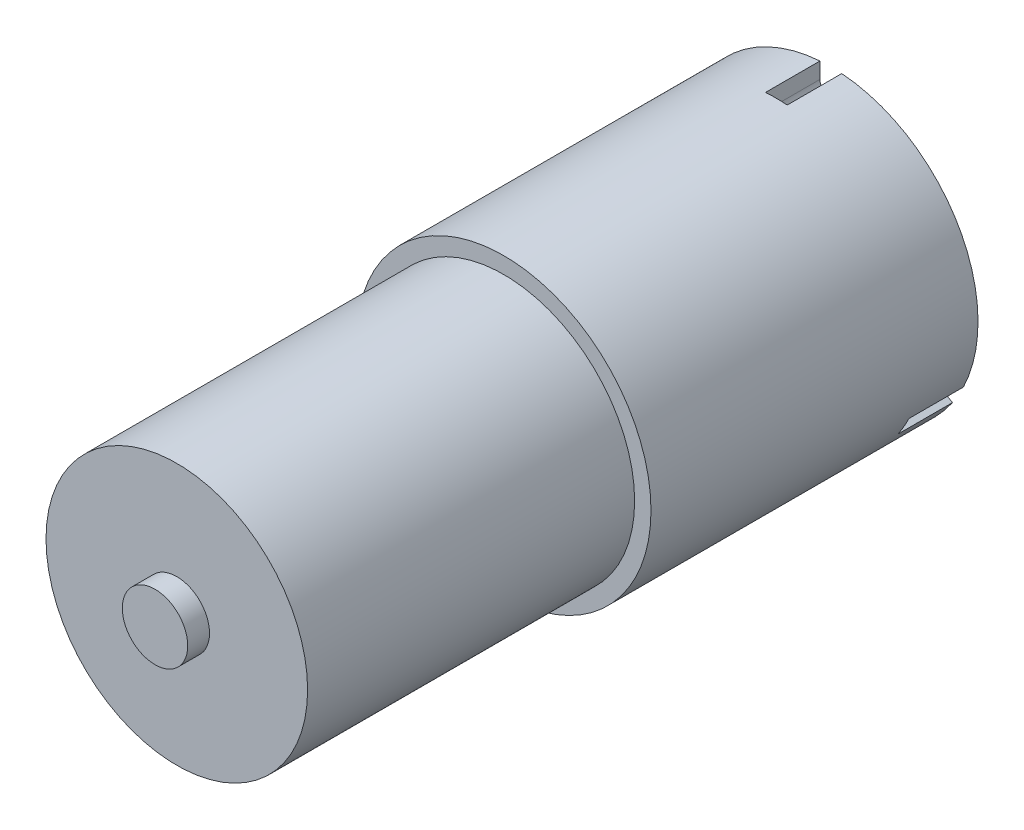
ISO-10303-21;
HEADER;
FILE_DESCRIPTION(('STEP AP214'),'2;1');
FILE_NAME('part.step','',(''),(''),'','','');
FILE_SCHEMA(('AUTOMOTIVE_DESIGN { 1 0 10303 214 1 1 1 1 }'));
ENDSEC;
DATA;
#1=APPLICATION_CONTEXT('core data for automotive mechanical design processes');
#2=APPLICATION_PROTOCOL_DEFINITION('international standard','automotive_design',2000,#1);
#3=PRODUCT_CONTEXT('',#1,'mechanical');
#4=PRODUCT('Part','Part','',(#3));
#5=PRODUCT_RELATED_PRODUCT_CATEGORY('part','',(#4));
#6=PRODUCT_DEFINITION_FORMATION('','',#4);
#7=PRODUCT_DEFINITION_CONTEXT('part definition',#1,'design');
#8=PRODUCT_DEFINITION('design','',#6,#7);
#9=PRODUCT_DEFINITION_SHAPE('','',#8);
#10=(LENGTH_UNIT() NAMED_UNIT(*) SI_UNIT(.MILLI.,.METRE.));
#11=(NAMED_UNIT(*) PLANE_ANGLE_UNIT() SI_UNIT($,.RADIAN.));
#12=(NAMED_UNIT(*) SI_UNIT($,.STERADIAN.) SOLID_ANGLE_UNIT());
#13=UNCERTAINTY_MEASURE_WITH_UNIT(LENGTH_MEASURE(1.E-05),#10,'distance_accuracy_value','');
#14=(GEOMETRIC_REPRESENTATION_CONTEXT(3) GLOBAL_UNCERTAINTY_ASSIGNED_CONTEXT((#13)) GLOBAL_UNIT_ASSIGNED_CONTEXT((#10,
#11,#12)) REPRESENTATION_CONTEXT('',''));
#15=CARTESIAN_POINT('',(0.,0.,0.));
#16=DIRECTION('',(0.,0.,1.));
#17=DIRECTION('',(1.,0.,0.));
#18=AXIS2_PLACEMENT_3D('',#15,#16,#17);
#19=CARTESIAN_POINT('',(0.,0.,30.));
#20=DIRECTION('',(0.,0.,-1.));
#21=DIRECTION('',(-1.,0.,0.));
#22=AXIS2_PLACEMENT_3D('',#19,#20,#21);
#23=CYLINDRICAL_SURFACE('',#22,13.5);
#24=CARTESIAN_POINT('',(0.,0.,0.));
#25=DIRECTION('',(0.,0.,1.));
#26=DIRECTION('',(1.,0.,0.));
#27=AXIS2_PLACEMENT_3D('',#24,#25,#26);
#28=CIRCLE('',#27,13.5);
#29=CARTESIAN_POINT('',(12.1592238163608,-5.86543060513416,0.));
#30=VERTEX_POINT('',#29);
#31=CARTESIAN_POINT('',(1.,13.4629120178363,0.));
#32=VERTEX_POINT('',#31);
#33=EDGE_CURVE('E210',#30,#32,#28,.T.);
#34=ORIENTED_EDGE('',*,*,#33,.T.);
#35=DIRECTION('',(0.,0.,-1.));
#36=VECTOR('',#35,1.);
#37=CARTESIAN_POINT('',(1.,13.4629120178363,30.));
#38=LINE('',#37,#36);
#39=CARTESIAN_POINT('',(1.,13.4629120178363,5.));
#40=VERTEX_POINT('',#39);
#41=EDGE_CURVE('E196',#32,#40,#38,.F.);
#42=ORIENTED_EDGE('',*,*,#41,.T.);
#43=CARTESIAN_POINT('',(0.,0.,5.));
#44=DIRECTION('',(0.,0.,-1.));
#45=DIRECTION('',(-1.,0.,0.));
#46=AXIS2_PLACEMENT_3D('',#43,#44,#45);
#47=CIRCLE('',#46,13.5);
#48=CARTESIAN_POINT('',(-1.,13.4629120178363,5.));
#49=VERTEX_POINT('',#48);
#50=EDGE_CURVE('E232',#49,#40,#47,.T.);
#51=ORIENTED_EDGE('',*,*,#50,.F.);
#52=DIRECTION('',(0.,0.,-1.));
#53=VECTOR('',#52,1.);
#54=CARTESIAN_POINT('',(-1.,13.4629120178363,30.));
#55=LINE('',#54,#53);
#56=CARTESIAN_POINT('',(-1.,13.4629120178363,0.));
#57=VERTEX_POINT('',#56);
#58=EDGE_CURVE('E136',#49,#57,#55,.T.);
#59=ORIENTED_EDGE('',*,*,#58,.T.);
#60=CARTESIAN_POINT('',(-12.1592238163612,-5.86543060513323,0.));
#61=VERTEX_POINT('',#60);
#62=EDGE_CURVE('E216',#57,#61,#28,.T.);
#63=ORIENTED_EDGE('',*,*,#62,.T.);
#64=DIRECTION('',(0.,0.,-1.));
#65=VECTOR('',#64,1.);
#66=CARTESIAN_POINT('',(-12.1592238163612,-5.86543060513323,30.));
#67=LINE('',#66,#65);
#68=CARTESIAN_POINT('',(-12.1592238163612,-5.86543060513323,5.));
#69=VERTEX_POINT('',#68);
#70=EDGE_CURVE('E192',#61,#69,#67,.F.);
#71=ORIENTED_EDGE('',*,*,#70,.T.);
#72=CARTESIAN_POINT('',(0.,0.,5.));
#73=DIRECTION('',(0.,0.,-1.));
#74=DIRECTION('',(-1.,0.,0.));
#75=AXIS2_PLACEMENT_3D('',#72,#73,#74);
#76=CIRCLE('',#75,13.5);
#77=CARTESIAN_POINT('',(-11.1592238163613,-7.59748141270214,5.));
#78=VERTEX_POINT('',#77);
#79=EDGE_CURVE('E230',#78,#69,#76,.T.);
#80=ORIENTED_EDGE('',*,*,#79,.F.);
#81=DIRECTION('',(0.,0.,-1.));
#82=VECTOR('',#81,1.);
#83=CARTESIAN_POINT('',(-11.1592238163613,-7.59748141270214,30.));
#84=LINE('',#83,#82);
#85=CARTESIAN_POINT('',(-11.1592238163613,-7.59748141270214,0.));
#86=VERTEX_POINT('',#85);
#87=EDGE_CURVE('E189',#78,#86,#84,.T.);
#88=ORIENTED_EDGE('',*,*,#87,.T.);
#89=CARTESIAN_POINT('',(11.1592238163607,-7.597481412703,0.));
#90=VERTEX_POINT('',#89);
#91=EDGE_CURVE('E219',#86,#90,#28,.T.);
#92=ORIENTED_EDGE('',*,*,#91,.T.);
#93=DIRECTION('',(0.,0.,-1.));
#94=VECTOR('',#93,1.);
#95=CARTESIAN_POINT('',(11.1592238163607,-7.597481412703,30.));
#96=LINE('',#95,#94);
#97=CARTESIAN_POINT('',(11.1592238163607,-7.597481412703,5.));
#98=VERTEX_POINT('',#97);
#99=EDGE_CURVE('E186',#90,#98,#96,.F.);
#100=ORIENTED_EDGE('',*,*,#99,.T.);
#101=CARTESIAN_POINT('',(0.,0.,5.));
#102=DIRECTION('',(0.,0.,-1.));
#103=DIRECTION('',(-1.,0.,0.));
#104=AXIS2_PLACEMENT_3D('',#101,#102,#103);
#105=CIRCLE('',#104,13.5);
#106=CARTESIAN_POINT('',(12.1592238163608,-5.86543060513416,5.));
#107=VERTEX_POINT('',#106);
#108=EDGE_CURVE('E228',#107,#98,#105,.T.);
#109=ORIENTED_EDGE('',*,*,#108,.F.);
#110=DIRECTION('',(0.,0.,-1.));
#111=VECTOR('',#110,1.);
#112=CARTESIAN_POINT('',(12.1592238163608,-5.86543060513416,30.));
#113=LINE('',#112,#111);
#114=EDGE_CURVE('E150',#107,#30,#113,.T.);
#115=ORIENTED_EDGE('',*,*,#114,.T.);
#116=EDGE_LOOP('',(#34,#42,#51,#59,#63,#71,#80,#88,#92,#100,#109,#115));
#117=FACE_BOUND('',#116,.T.);
#118=CARTESIAN_POINT('',(0.,0.,30.));
#119=DIRECTION('',(0.,0.,1.));
#120=DIRECTION('',(1.,0.,0.));
#121=AXIS2_PLACEMENT_3D('',#118,#119,#120);
#122=CIRCLE('',#121,13.5);
#123=CARTESIAN_POINT('',(13.5,0.,30.));
#124=VERTEX_POINT('',#123);
#125=EDGE_CURVE('E213',#124,#124,#122,.T.);
#126=ORIENTED_EDGE('',*,*,#125,.F.);
#127=EDGE_LOOP('',(#126));
#128=FACE_BOUND('',#127,.T.);
#129=ADVANCED_FACE('F33',(#117,#128),#23,.T.);
#130=CARTESIAN_POINT('',(0.,0.,30.));
#131=DIRECTION('',(0.,0.,1.));
#132=DIRECTION('',(1.,0.,0.));
#133=AXIS2_PLACEMENT_3D('',#130,#131,#132);
#134=PLANE('',#133);
#135=CARTESIAN_POINT('',(0.,0.,30.));
#136=DIRECTION('',(0.,0.,1.));
#137=DIRECTION('',(1.,0.,0.));
#138=AXIS2_PLACEMENT_3D('',#135,#136,#137);
#139=CIRCLE('',#138,12.);
#140=CARTESIAN_POINT('',(12.,0.,30.));
#141=VERTEX_POINT('',#140);
#142=EDGE_CURVE('E207',#141,#141,#139,.T.);
#143=ORIENTED_EDGE('',*,*,#142,.F.);
#144=EDGE_LOOP('',(#143));
#145=FACE_BOUND('',#144,.T.);
#146=ORIENTED_EDGE('',*,*,#125,.T.);
#147=EDGE_LOOP('',(#146));
#148=FACE_BOUND('',#147,.T.);
#149=ADVANCED_FACE('F259',(#145,#148),#134,.T.);
#150=CARTESIAN_POINT('',(0.,0.,0.));
#151=DIRECTION('',(0.,0.,1.));
#152=DIRECTION('',(1.,0.,0.));
#153=AXIS2_PLACEMENT_3D('',#150,#151,#152);
#154=PLANE('',#153);
#155=CARTESIAN_POINT('',(-6.,0.,0.));
#156=DIRECTION('',(0.,0.,1.));
#157=DIRECTION('',(1.,0.,0.));
#158=AXIS2_PLACEMENT_3D('',#155,#156,#157);
#159=CIRCLE('',#158,1.25);
#160=CARTESIAN_POINT('',(-4.75,0.,0.));
#161=VERTEX_POINT('',#160);
#162=EDGE_CURVE('E237',#161,#161,#159,.F.);
#163=ORIENTED_EDGE('',*,*,#162,.F.);
#164=EDGE_LOOP('',(#163));
#165=FACE_BOUND('',#164,.T.);
#166=CARTESIAN_POINT('',(0.,0.,0.));
#167=DIRECTION('',(0.,0.,1.));
#168=DIRECTION('',(1.,0.,0.));
#169=AXIS2_PLACEMENT_3D('',#166,#167,#168);
#170=CIRCLE('',#169,1.25);
#171=CARTESIAN_POINT('',(1.25,0.,0.));
#172=VERTEX_POINT('',#171);
#173=EDGE_CURVE('E234',#172,#172,#170,.F.);
#174=ORIENTED_EDGE('',*,*,#173,.F.);
#175=EDGE_LOOP('',(#174));
#176=FACE_BOUND('',#175,.T.);
#177=CARTESIAN_POINT('',(0.,12.,0.));
#178=DIRECTION('',(0.,0.,-1.));
#179=DIRECTION('',(-1.,0.,0.));
#180=AXIS2_PLACEMENT_3D('',#177,#178,#179);
#181=CIRCLE('',#180,1.);
#182=CARTESIAN_POINT('',(1.,12.,0.));
#183=VERTEX_POINT('',#182);
#184=CARTESIAN_POINT('',(-1.,12.,0.));
#185=VERTEX_POINT('',#184);
#186=EDGE_CURVE('E48',#183,#185,#181,.T.);
#187=ORIENTED_EDGE('',*,*,#186,.F.);
#188=DIRECTION('',(0.,1.,0.));
#189=VECTOR('',#188,1.);
#190=CARTESIAN_POINT('',(1.,0.,0.));
#191=LINE('',#190,#189);
#192=EDGE_CURVE('E225',#183,#32,#191,.T.);
#193=ORIENTED_EDGE('',*,*,#192,.T.);
#194=ORIENTED_EDGE('',*,*,#33,.F.);
#195=DIRECTION('',(0.866025403784438,-0.500000000000001,0.));
#196=VECTOR('',#195,1.);
#197=CARTESIAN_POINT('',(12.6059487402151,-6.12334736017517,0.));
#198=LINE('',#197,#196);
#199=CARTESIAN_POINT('',(10.8923048454128,-5.13397459621586,0.));
#200=VERTEX_POINT('',#199);
#201=EDGE_CURVE('E171',#200,#30,#198,.T.);
#202=ORIENTED_EDGE('',*,*,#201,.F.);
#203=CARTESIAN_POINT('',(10.3923048454128,-6.0000000000003,0.));
#204=DIRECTION('',(0.,0.,-1.));
#205=DIRECTION('',(-1.,0.,0.));
#206=AXIS2_PLACEMENT_3D('',#203,#204,#205);
#207=CIRCLE('',#206,1.);
#208=CARTESIAN_POINT('',(9.89230484541275,-6.86602540378474,0.));
#209=VERTEX_POINT('',#208);
#210=EDGE_CURVE('E177',#209,#200,#207,.T.);
#211=ORIENTED_EDGE('',*,*,#210,.F.);
#212=DIRECTION('',(0.866025403784438,-0.500000000000001,0.));
#213=VECTOR('',#212,1.);
#214=CARTESIAN_POINT('',(-0.500000000000255,-0.866025403784878,0.));
#215=LINE('',#214,#213);
#216=EDGE_CURVE('E206',#209,#90,#215,.T.);
#217=ORIENTED_EDGE('',*,*,#216,.T.);
#218=ORIENTED_EDGE('',*,*,#91,.F.);
#219=DIRECTION('',(-0.866025403784439,-0.499999999999999,0.));
#220=VECTOR('',#219,1.);
#221=CARTESIAN_POINT('',(-11.6059487402161,-7.85539816774345,0.));
#222=LINE('',#221,#220);
#223=CARTESIAN_POINT('',(-9.89230484541378,-6.86602540378414,0.));
#224=VERTEX_POINT('',#223);
#225=EDGE_CURVE('E156',#224,#86,#222,.T.);
#226=ORIENTED_EDGE('',*,*,#225,.F.);
#227=CARTESIAN_POINT('',(-10.3923048454138,-5.99999999999971,0.));
#228=DIRECTION('',(0.,0.,-1.));
#229=DIRECTION('',(-1.,0.,0.));
#230=AXIS2_PLACEMENT_3D('',#227,#228,#229);
#231=CIRCLE('',#230,1.);
#232=CARTESIAN_POINT('',(-10.8923048454138,-5.13397459621526,0.));
#233=VERTEX_POINT('',#232);
#234=EDGE_CURVE('E56',#233,#224,#231,.T.);
#235=ORIENTED_EDGE('',*,*,#234,.F.);
#236=DIRECTION('',(-0.866025403784439,-0.5,0.));
#237=VECTOR('',#236,1.);
#238=CARTESIAN_POINT('',(-0.500000000000252,0.866025403784876,0.));
#239=LINE('',#238,#237);
#240=EDGE_CURVE('E222',#233,#61,#239,.T.);
#241=ORIENTED_EDGE('',*,*,#240,.T.);
#242=ORIENTED_EDGE('',*,*,#62,.F.);
#243=DIRECTION('',(0.,1.,0.));
#244=VECTOR('',#243,1.);
#245=CARTESIAN_POINT('',(-1.,13.9787455279186,0.));
#246=LINE('',#245,#244);
#247=EDGE_CURVE('E143',#185,#57,#246,.T.);
#248=ORIENTED_EDGE('',*,*,#247,.F.);
#249=EDGE_LOOP('',(#187,#193,#194,#202,#211,#217,#218,#226,#235,#241,#242,#248));
#250=FACE_BOUND('',#249,.T.);
#251=ADVANCED_FACE('F265',(#165,#176,#250),#154,.F.);
#252=CARTESIAN_POINT('',(0.,0.,60.));
#253=DIRECTION('',(0.,0.,-1.));
#254=DIRECTION('',(-1.,0.,0.));
#255=AXIS2_PLACEMENT_3D('',#252,#253,#254);
#256=CYLINDRICAL_SURFACE('',#255,12.);
#257=CARTESIAN_POINT('',(0.,0.,60.));
#258=DIRECTION('',(0.,0.,1.));
#259=DIRECTION('',(1.,0.,0.));
#260=AXIS2_PLACEMENT_3D('',#257,#258,#259);
#261=CIRCLE('',#260,12.);
#262=CARTESIAN_POINT('',(12.,0.,60.));
#263=VERTEX_POINT('',#262);
#264=EDGE_CURVE('E202',#263,#263,#261,.T.);
#265=ORIENTED_EDGE('',*,*,#264,.F.);
#266=EDGE_LOOP('',(#265));
#267=FACE_BOUND('',#266,.T.);
#268=ORIENTED_EDGE('',*,*,#142,.T.);
#269=EDGE_LOOP('',(#268));
#270=FACE_BOUND('',#269,.T.);
#271=ADVANCED_FACE('F271',(#267,#270),#256,.T.);
#272=CARTESIAN_POINT('',(0.,0.,60.));
#273=DIRECTION('',(0.,0.,1.));
#274=DIRECTION('',(1.,0.,0.));
#275=AXIS2_PLACEMENT_3D('',#272,#273,#274);
#276=PLANE('',#275);
#277=CARTESIAN_POINT('',(0.,0.,60.));
#278=DIRECTION('',(0.,0.,1.));
#279=DIRECTION('',(1.,0.,0.));
#280=AXIS2_PLACEMENT_3D('',#277,#278,#279);
#281=CIRCLE('',#280,3.);
#282=CARTESIAN_POINT('',(3.,0.,60.));
#283=VERTEX_POINT('',#282);
#284=EDGE_CURVE('E203',#283,#283,#281,.T.);
#285=ORIENTED_EDGE('',*,*,#284,.F.);
#286=EDGE_LOOP('',(#285));
#287=FACE_BOUND('',#286,.T.);
#288=ORIENTED_EDGE('',*,*,#264,.T.);
#289=EDGE_LOOP('',(#288));
#290=FACE_BOUND('',#289,.T.);
#291=ADVANCED_FACE('F276',(#287,#290),#276,.T.);
#292=CARTESIAN_POINT('',(0.,0.,62.));
#293=DIRECTION('',(0.,0.,-1.));
#294=DIRECTION('',(-1.,0.,0.));
#295=AXIS2_PLACEMENT_3D('',#292,#293,#294);
#296=CYLINDRICAL_SURFACE('',#295,3.);
#297=CARTESIAN_POINT('',(0.,0.,62.));
#298=DIRECTION('',(0.,0.,1.));
#299=DIRECTION('',(1.,0.,0.));
#300=AXIS2_PLACEMENT_3D('',#297,#298,#299);
#301=CIRCLE('',#300,3.);
#302=CARTESIAN_POINT('',(3.,0.,62.));
#303=VERTEX_POINT('',#302);
#304=EDGE_CURVE('E199',#303,#303,#301,.T.);
#305=ORIENTED_EDGE('',*,*,#304,.F.);
#306=EDGE_LOOP('',(#305));
#307=FACE_BOUND('',#306,.T.);
#308=ORIENTED_EDGE('',*,*,#284,.T.);
#309=EDGE_LOOP('',(#308));
#310=FACE_BOUND('',#309,.T.);
#311=ADVANCED_FACE('F280',(#307,#310),#296,.T.);
#312=CARTESIAN_POINT('',(0.,0.,62.));
#313=DIRECTION('',(0.,0.,1.));
#314=DIRECTION('',(1.,0.,0.));
#315=AXIS2_PLACEMENT_3D('',#312,#313,#314);
#316=PLANE('',#315);
#317=ORIENTED_EDGE('',*,*,#304,.T.);
#318=EDGE_LOOP('',(#317));
#319=FACE_BOUND('',#318,.T.);
#320=ADVANCED_FACE('F284',(#319),#316,.T.);
#321=CARTESIAN_POINT('',(10.3923048454128,-6.0000000000003,5.));
#322=DIRECTION('',(0.,0.,-1.));
#323=DIRECTION('',(-1.,0.,0.));
#324=AXIS2_PLACEMENT_3D('',#321,#322,#323);
#325=PLANE('',#324);
#326=ORIENTED_EDGE('',*,*,#108,.T.);
#327=DIRECTION('',(-0.866025403784438,0.500000000000001,0.));
#328=VECTOR('',#327,1.);
#329=CARTESIAN_POINT('',(9.89230484541275,-6.86602540378474,5.));
#330=LINE('',#329,#328);
#331=CARTESIAN_POINT('',(9.89230484541275,-6.86602540378474,5.));
#332=VERTEX_POINT('',#331);
#333=EDGE_CURVE('E174',#98,#332,#330,.T.);
#334=ORIENTED_EDGE('',*,*,#333,.T.);
#335=CARTESIAN_POINT('',(10.3923048454128,-6.0000000000003,5.));
#336=DIRECTION('',(0.,0.,-1.));
#337=DIRECTION('',(-1.,0.,0.));
#338=AXIS2_PLACEMENT_3D('',#335,#336,#337);
#339=CIRCLE('',#338,1.);
#340=CARTESIAN_POINT('',(10.8923048454128,-5.13397459621586,5.));
#341=VERTEX_POINT('',#340);
#342=EDGE_CURVE('E167',#332,#341,#339,.T.);
#343=ORIENTED_EDGE('',*,*,#342,.T.);
#344=DIRECTION('',(0.866025403784438,-0.500000000000001,0.));
#345=VECTOR('',#344,1.);
#346=CARTESIAN_POINT('',(12.6059487402151,-6.12334736017517,5.));
#347=LINE('',#346,#345);
#348=EDGE_CURVE('E170',#341,#107,#347,.T.);
#349=ORIENTED_EDGE('',*,*,#348,.T.);
#350=EDGE_LOOP('',(#326,#334,#343,#349));
#351=FACE_BOUND('',#350,.T.);
#352=ADVANCED_FACE('F288',(#351),#325,.T.);
#353=CARTESIAN_POINT('',(9.89230484541275,-6.86602540378474,5.));
#354=DIRECTION('',(-0.500000000000001,-0.866025403784438,0.));
#355=DIRECTION('',(0.866025403784438,-0.500000000000001,0.));
#356=AXIS2_PLACEMENT_3D('',#353,#354,#355);
#357=PLANE('',#356);
#358=ORIENTED_EDGE('',*,*,#216,.F.);
#359=DIRECTION('',(0.,0.,-1.));
#360=VECTOR('',#359,1.);
#361=CARTESIAN_POINT('',(9.89230484541275,-6.86602540378474,5.));
#362=LINE('',#361,#360);
#363=EDGE_CURVE('E163',#332,#209,#362,.T.);
#364=ORIENTED_EDGE('',*,*,#363,.F.);
#365=ORIENTED_EDGE('',*,*,#333,.F.);
#366=ORIENTED_EDGE('',*,*,#99,.F.);
#367=EDGE_LOOP('',(#358,#364,#365,#366));
#368=FACE_BOUND('',#367,.T.);
#369=ADVANCED_FACE('F298',(#368),#357,.F.);
#370=CARTESIAN_POINT('',(12.6059487402151,-6.12334736017517,5.));
#371=DIRECTION('',(0.500000000000001,0.866025403784438,0.));
#372=DIRECTION('',(-0.866025403784438,0.500000000000001,0.));
#373=AXIS2_PLACEMENT_3D('',#370,#371,#372);
#374=PLANE('',#373);
#375=ORIENTED_EDGE('',*,*,#348,.F.);
#376=DIRECTION('',(0.,0.,-1.));
#377=VECTOR('',#376,1.);
#378=CARTESIAN_POINT('',(10.8923048454128,-5.13397459621586,5.));
#379=LINE('',#378,#377);
#380=EDGE_CURVE('E176',#341,#200,#379,.T.);
#381=ORIENTED_EDGE('',*,*,#380,.T.);
#382=ORIENTED_EDGE('',*,*,#201,.T.);
#383=ORIENTED_EDGE('',*,*,#114,.F.);
#384=EDGE_LOOP('',(#375,#381,#382,#383));
#385=FACE_BOUND('',#384,.T.);
#386=ADVANCED_FACE('F294',(#385),#374,.F.);
#387=CARTESIAN_POINT('',(10.3923048454128,-6.0000000000003,5.));
#388=DIRECTION('',(0.,0.,-1.));
#389=DIRECTION('',(-1.,0.,0.));
#390=AXIS2_PLACEMENT_3D('',#387,#388,#389);
#391=CYLINDRICAL_SURFACE('',#390,1.);
#392=ORIENTED_EDGE('',*,*,#210,.T.);
#393=ORIENTED_EDGE('',*,*,#380,.F.);
#394=ORIENTED_EDGE('',*,*,#342,.F.);
#395=ORIENTED_EDGE('',*,*,#363,.T.);
#396=EDGE_LOOP('',(#392,#393,#394,#395));
#397=FACE_BOUND('',#396,.T.);
#398=ADVANCED_FACE('F290',(#397),#391,.F.);
#399=CARTESIAN_POINT('',(-10.3923048454138,-5.99999999999971,5.));
#400=DIRECTION('',(0.,0.,-1.));
#401=DIRECTION('',(-1.,0.,0.));
#402=AXIS2_PLACEMENT_3D('',#399,#400,#401);
#403=PLANE('',#402);
#404=ORIENTED_EDGE('',*,*,#79,.T.);
#405=DIRECTION('',(0.866025403784439,0.499999999999999,0.));
#406=VECTOR('',#405,1.);
#407=CARTESIAN_POINT('',(-10.8923048454138,-5.13397459621526,5.));
#408=LINE('',#407,#406);
#409=CARTESIAN_POINT('',(-10.8923048454138,-5.13397459621526,5.));
#410=VERTEX_POINT('',#409);
#411=EDGE_CURVE('E159',#69,#410,#408,.T.);
#412=ORIENTED_EDGE('',*,*,#411,.T.);
#413=CARTESIAN_POINT('',(-10.3923048454138,-5.99999999999971,5.));
#414=DIRECTION('',(0.,0.,-1.));
#415=DIRECTION('',(-1.,0.,0.));
#416=AXIS2_PLACEMENT_3D('',#413,#414,#415);
#417=CIRCLE('',#416,1.);
#418=CARTESIAN_POINT('',(-9.89230484541378,-6.86602540378414,5.));
#419=VERTEX_POINT('',#418);
#420=EDGE_CURVE('E152',#410,#419,#417,.T.);
#421=ORIENTED_EDGE('',*,*,#420,.T.);
#422=DIRECTION('',(-0.866025403784439,-0.499999999999999,0.));
#423=VECTOR('',#422,1.);
#424=CARTESIAN_POINT('',(-11.6059487402161,-7.85539816774345,5.));
#425=LINE('',#424,#423);
#426=EDGE_CURVE('E155',#419,#78,#425,.T.);
#427=ORIENTED_EDGE('',*,*,#426,.T.);
#428=EDGE_LOOP('',(#404,#412,#421,#427));
#429=FACE_BOUND('',#428,.T.);
#430=ADVANCED_FACE('F293',(#429),#403,.T.);
#431=CARTESIAN_POINT('',(-10.8923048454138,-5.13397459621526,5.));
#432=DIRECTION('',(-0.5,0.866025403784439,0.));
#433=DIRECTION('',(-0.866025403784439,-0.5,0.));
#434=AXIS2_PLACEMENT_3D('',#431,#432,#433);
#435=PLANE('',#434);
#436=ORIENTED_EDGE('',*,*,#240,.F.);
#437=DIRECTION('',(0.,0.,-1.));
#438=VECTOR('',#437,1.);
#439=CARTESIAN_POINT('',(-10.8923048454138,-5.13397459621526,5.));
#440=LINE('',#439,#438);
#441=EDGE_CURVE('E148',#410,#233,#440,.T.);
#442=ORIENTED_EDGE('',*,*,#441,.F.);
#443=ORIENTED_EDGE('',*,*,#411,.F.);
#444=ORIENTED_EDGE('',*,*,#70,.F.);
#445=EDGE_LOOP('',(#436,#442,#443,#444));
#446=FACE_BOUND('',#445,.T.);
#447=ADVANCED_FACE('F312',(#446),#435,.F.);
#448=CARTESIAN_POINT('',(-11.6059487402161,-7.85539816774345,5.));
#449=DIRECTION('',(0.5,-0.866025403784439,0.));
#450=DIRECTION('',(0.866025403784439,0.5,0.));
#451=AXIS2_PLACEMENT_3D('',#448,#449,#450);
#452=PLANE('',#451);
#453=ORIENTED_EDGE('',*,*,#426,.F.);
#454=DIRECTION('',(0.,0.,-1.));
#455=VECTOR('',#454,1.);
#456=CARTESIAN_POINT('',(-9.89230484541378,-6.86602540378414,5.));
#457=LINE('',#456,#455);
#458=EDGE_CURVE('E161',#419,#224,#457,.T.);
#459=ORIENTED_EDGE('',*,*,#458,.T.);
#460=ORIENTED_EDGE('',*,*,#225,.T.);
#461=ORIENTED_EDGE('',*,*,#87,.F.);
#462=EDGE_LOOP('',(#453,#459,#460,#461));
#463=FACE_BOUND('',#462,.T.);
#464=ADVANCED_FACE('F309',(#463),#452,.F.);
#465=CARTESIAN_POINT('',(-10.3923048454138,-5.99999999999971,5.));
#466=DIRECTION('',(0.,0.,-1.));
#467=DIRECTION('',(-1.,0.,0.));
#468=AXIS2_PLACEMENT_3D('',#465,#466,#467);
#469=CYLINDRICAL_SURFACE('',#468,1.);
#470=ORIENTED_EDGE('',*,*,#234,.T.);
#471=ORIENTED_EDGE('',*,*,#458,.F.);
#472=ORIENTED_EDGE('',*,*,#420,.F.);
#473=ORIENTED_EDGE('',*,*,#441,.T.);
#474=EDGE_LOOP('',(#470,#471,#472,#473));
#475=FACE_BOUND('',#474,.T.);
#476=ADVANCED_FACE('F306',(#475),#469,.F.);
#477=CARTESIAN_POINT('',(0.,12.,5.));
#478=DIRECTION('',(0.,0.,-1.));
#479=DIRECTION('',(-1.,0.,0.));
#480=AXIS2_PLACEMENT_3D('',#477,#478,#479);
#481=PLANE('',#480);
#482=ORIENTED_EDGE('',*,*,#50,.T.);
#483=DIRECTION('',(0.,-1.,0.));
#484=VECTOR('',#483,1.);
#485=CARTESIAN_POINT('',(1.,12.,5.));
#486=LINE('',#485,#484);
#487=CARTESIAN_POINT('',(1.,12.,5.));
#488=VERTEX_POINT('',#487);
#489=EDGE_CURVE('E130',#40,#488,#486,.T.);
#490=ORIENTED_EDGE('',*,*,#489,.T.);
#491=CARTESIAN_POINT('',(0.,12.,5.));
#492=DIRECTION('',(0.,0.,-1.));
#493=DIRECTION('',(-1.,0.,0.));
#494=AXIS2_PLACEMENT_3D('',#491,#492,#493);
#495=CIRCLE('',#494,1.);
#496=CARTESIAN_POINT('',(-1.,12.,5.));
#497=VERTEX_POINT('',#496);
#498=EDGE_CURVE('E126',#488,#497,#495,.T.);
#499=ORIENTED_EDGE('',*,*,#498,.T.);
#500=DIRECTION('',(0.,1.,0.));
#501=VECTOR('',#500,1.);
#502=CARTESIAN_POINT('',(-1.,13.9787455279186,5.));
#503=LINE('',#502,#501);
#504=EDGE_CURVE('E133',#497,#49,#503,.T.);
#505=ORIENTED_EDGE('',*,*,#504,.T.);
#506=EDGE_LOOP('',(#482,#490,#499,#505));
#507=FACE_BOUND('',#506,.T.);
#508=ADVANCED_FACE('F140',(#507),#481,.T.);
#509=CARTESIAN_POINT('',(1.,12.,5.));
#510=DIRECTION('',(1.,0.,0.));
#511=DIRECTION('',(0.,0.,-1.));
#512=AXIS2_PLACEMENT_3D('',#509,#510,#511);
#513=PLANE('',#512);
#514=ORIENTED_EDGE('',*,*,#192,.F.);
#515=DIRECTION('',(0.,0.,-1.));
#516=VECTOR('',#515,1.);
#517=CARTESIAN_POINT('',(1.,12.,5.));
#518=LINE('',#517,#516);
#519=EDGE_CURVE('E129',#488,#183,#518,.T.);
#520=ORIENTED_EDGE('',*,*,#519,.F.);
#521=ORIENTED_EDGE('',*,*,#489,.F.);
#522=ORIENTED_EDGE('',*,*,#41,.F.);
#523=EDGE_LOOP('',(#514,#520,#521,#522));
#524=FACE_BOUND('',#523,.T.);
#525=ADVANCED_FACE('F325',(#524),#513,.F.);
#526=CARTESIAN_POINT('',(-1.,13.9787455279186,5.));
#527=DIRECTION('',(-1.,0.,0.));
#528=DIRECTION('',(0.,0.,1.));
#529=AXIS2_PLACEMENT_3D('',#526,#527,#528);
#530=PLANE('',#529);
#531=ORIENTED_EDGE('',*,*,#504,.F.);
#532=DIRECTION('',(0.,0.,-1.));
#533=VECTOR('',#532,1.);
#534=CARTESIAN_POINT('',(-1.,12.,5.));
#535=LINE('',#534,#533);
#536=EDGE_CURVE('E122',#497,#185,#535,.T.);
#537=ORIENTED_EDGE('',*,*,#536,.T.);
#538=ORIENTED_EDGE('',*,*,#247,.T.);
#539=ORIENTED_EDGE('',*,*,#58,.F.);
#540=EDGE_LOOP('',(#531,#537,#538,#539));
#541=FACE_BOUND('',#540,.T.);
#542=ADVANCED_FACE('F134',(#541),#530,.F.);
#543=CARTESIAN_POINT('',(0.,12.,5.));
#544=DIRECTION('',(0.,0.,-1.));
#545=DIRECTION('',(-1.,0.,0.));
#546=AXIS2_PLACEMENT_3D('',#543,#544,#545);
#547=CYLINDRICAL_SURFACE('',#546,1.);
#548=ORIENTED_EDGE('',*,*,#186,.T.);
#549=ORIENTED_EDGE('',*,*,#536,.F.);
#550=ORIENTED_EDGE('',*,*,#498,.F.);
#551=ORIENTED_EDGE('',*,*,#519,.T.);
#552=EDGE_LOOP('',(#548,#549,#550,#551));
#553=FACE_BOUND('',#552,.T.);
#554=ADVANCED_FACE('F124',(#553),#547,.F.);
#555=CARTESIAN_POINT('',(0.,0.,-5.));
#556=DIRECTION('',(0.,0.,1.));
#557=DIRECTION('',(1.,0.,0.));
#558=AXIS2_PLACEMENT_3D('',#555,#556,#557);
#559=CYLINDRICAL_SURFACE('',#558,1.25);
#560=CARTESIAN_POINT('',(0.,0.,-4.5));
#561=DIRECTION('',(0.,0.,-1.));
#562=DIRECTION('',(-1.,0.,0.));
#563=AXIS2_PLACEMENT_3D('',#560,#561,#562);
#564=CIRCLE('',#563,1.25);
#565=CARTESIAN_POINT('',(-1.25,0.,-4.5));
#566=VERTEX_POINT('',#565);
#567=EDGE_CURVE('E243',#566,#566,#564,.F.);
#568=ORIENTED_EDGE('',*,*,#567,.T.);
#569=EDGE_LOOP('',(#568));
#570=FACE_BOUND('',#569,.T.);
#571=ORIENTED_EDGE('',*,*,#173,.T.);
#572=EDGE_LOOP('',(#571));
#573=FACE_BOUND('',#572,.T.);
#574=ADVANCED_FACE('F322',(#570,#573),#559,.T.);
#575=CARTESIAN_POINT('',(0.,0.,-5.));
#576=DIRECTION('',(0.,0.,-1.));
#577=DIRECTION('',(-1.,0.,0.));
#578=AXIS2_PLACEMENT_3D('',#575,#576,#577);
#579=PLANE('',#578);
#580=CARTESIAN_POINT('',(0.,0.,-5.));
#581=DIRECTION('',(0.,0.,-1.));
#582=DIRECTION('',(-1.,0.,0.));
#583=AXIS2_PLACEMENT_3D('',#580,#581,#582);
#584=CIRCLE('',#583,0.75);
#585=CARTESIAN_POINT('',(-0.75,0.,-5.));
#586=VERTEX_POINT('',#585);
#587=EDGE_CURVE('E240',#586,#586,#584,.T.);
#588=ORIENTED_EDGE('',*,*,#587,.T.);
#589=EDGE_LOOP('',(#588));
#590=FACE_BOUND('',#589,.T.);
#591=ADVANCED_FACE('F333',(#590),#579,.T.);
#592=CARTESIAN_POINT('',(-6.,0.,-5.));
#593=DIRECTION('',(0.,0.,1.));
#594=DIRECTION('',(1.,0.,0.));
#595=AXIS2_PLACEMENT_3D('',#592,#593,#594);
#596=CYLINDRICAL_SURFACE('',#595,1.25);
#597=CARTESIAN_POINT('',(-6.,0.,-4.5));
#598=DIRECTION('',(0.,0.,-1.));
#599=DIRECTION('',(-1.,0.,0.));
#600=AXIS2_PLACEMENT_3D('',#597,#598,#599);
#601=CIRCLE('',#600,1.25);
#602=CARTESIAN_POINT('',(-7.25,0.,-4.5));
#603=VERTEX_POINT('',#602);
#604=EDGE_CURVE('E11',#603,#603,#601,.F.);
#605=ORIENTED_EDGE('',*,*,#604,.T.);
#606=EDGE_LOOP('',(#605));
#607=FACE_BOUND('',#606,.T.);
#608=ORIENTED_EDGE('',*,*,#162,.T.);
#609=EDGE_LOOP('',(#608));
#610=FACE_BOUND('',#609,.T.);
#611=ADVANCED_FACE('F337',(#607,#610),#596,.T.);
#612=CARTESIAN_POINT('',(-6.,0.,-5.));
#613=DIRECTION('',(0.,0.,-1.));
#614=DIRECTION('',(-1.,0.,0.));
#615=AXIS2_PLACEMENT_3D('',#612,#613,#614);
#616=PLANE('',#615);
#617=CARTESIAN_POINT('',(-6.,0.,-5.));
#618=DIRECTION('',(0.,0.,-1.));
#619=DIRECTION('',(-1.,0.,0.));
#620=AXIS2_PLACEMENT_3D('',#617,#618,#619);
#621=CIRCLE('',#620,0.749999999999999);
#622=CARTESIAN_POINT('',(-6.75,0.,-5.));
#623=VERTEX_POINT('',#622);
#624=EDGE_CURVE('E41',#623,#623,#621,.T.);
#625=ORIENTED_EDGE('',*,*,#624,.T.);
#626=EDGE_LOOP('',(#625));
#627=FACE_BOUND('',#626,.T.);
#628=ADVANCED_FACE('F248',(#627),#616,.T.);
#629=CARTESIAN_POINT('',(0.,0.,-4.5));
#630=DIRECTION('',(0.,0.,-1.));
#631=DIRECTION('',(-1.,0.,0.));
#632=AXIS2_PLACEMENT_3D('',#629,#630,#631);
#633=TOROIDAL_SURFACE('',#632,0.75,0.5);
#634=ORIENTED_EDGE('',*,*,#567,.F.);
#635=EDGE_LOOP('',(#634));
#636=FACE_BOUND('',#635,.T.);
#637=ORIENTED_EDGE('',*,*,#587,.F.);
#638=EDGE_LOOP('',(#637));
#639=FACE_BOUND('',#638,.T.);
#640=ADVANCED_FACE('F251',(#636,#639),#633,.T.);
#641=CARTESIAN_POINT('',(-6.,0.,-4.5));
#642=DIRECTION('',(0.,0.,-1.));
#643=DIRECTION('',(-1.,0.,0.));
#644=AXIS2_PLACEMENT_3D('',#641,#642,#643);
#645=TOROIDAL_SURFACE('',#644,0.749999999999999,0.5);
#646=ORIENTED_EDGE('',*,*,#604,.F.);
#647=EDGE_LOOP('',(#646));
#648=FACE_BOUND('',#647,.T.);
#649=ORIENTED_EDGE('',*,*,#624,.F.);
#650=EDGE_LOOP('',(#649));
#651=FACE_BOUND('',#650,.T.);
#652=ADVANCED_FACE('F35',(#648,#651),#645,.T.);
#653=CLOSED_SHELL('',(#129,#149,#251,#271,#291,#311,#320,#352,#369,#386,#398,#430,#447,#464,
#476,#508,#525,#542,#554,#574,#591,#611,#628,#640,#652));
#654=MANIFOLD_SOLID_BREP('B2',#653);
#655=ADVANCED_BREP_SHAPE_REPRESENTATION('',(#18,#654),#14);
#656=SHAPE_DEFINITION_REPRESENTATION(#9,#655);
ENDSEC;
END-ISO-10303-21;
